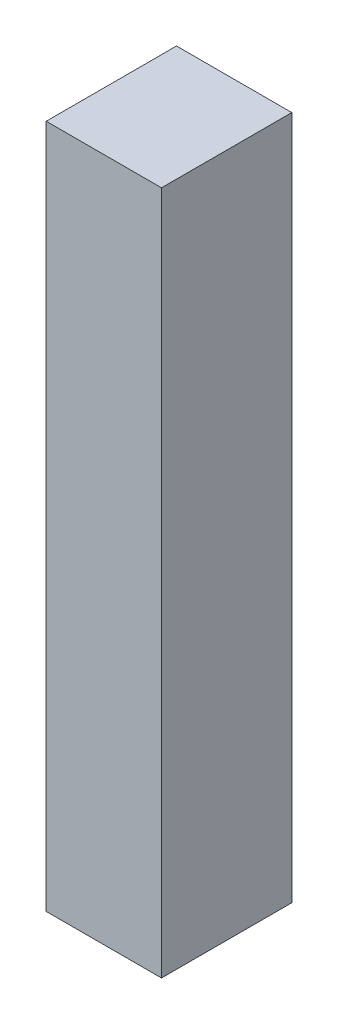
ISO-10303-21;
HEADER;
FILE_DESCRIPTION(('STEP AP214'),'2;1');
FILE_NAME('part.step','',(''),(''),'','','');
FILE_SCHEMA(('AUTOMOTIVE_DESIGN { 1 0 10303 214 1 1 1 1 }'));
ENDSEC;
DATA;
#1=APPLICATION_CONTEXT('core data for automotive mechanical design processes');
#2=APPLICATION_PROTOCOL_DEFINITION('international standard','automotive_design',2000,#1);
#3=PRODUCT_CONTEXT('',#1,'mechanical');
#4=PRODUCT('Part','Part','',(#3));
#5=PRODUCT_RELATED_PRODUCT_CATEGORY('part','',(#4));
#6=PRODUCT_DEFINITION_FORMATION('','',#4);
#7=PRODUCT_DEFINITION_CONTEXT('part definition',#1,'design');
#8=PRODUCT_DEFINITION('design','',#6,#7);
#9=PRODUCT_DEFINITION_SHAPE('','',#8);
#10=(LENGTH_UNIT() NAMED_UNIT(*) SI_UNIT(.MILLI.,.METRE.));
#11=(NAMED_UNIT(*) PLANE_ANGLE_UNIT() SI_UNIT($,.RADIAN.));
#12=(NAMED_UNIT(*) SI_UNIT($,.STERADIAN.) SOLID_ANGLE_UNIT());
#13=UNCERTAINTY_MEASURE_WITH_UNIT(LENGTH_MEASURE(1.E-05),#10,'distance_accuracy_value','');
#14=(GEOMETRIC_REPRESENTATION_CONTEXT(3) GLOBAL_UNCERTAINTY_ASSIGNED_CONTEXT((#13)) GLOBAL_UNIT_ASSIGNED_CONTEXT((#10,
#11,#12)) REPRESENTATION_CONTEXT('',''));
#15=CARTESIAN_POINT('',(0.,0.,0.));
#16=DIRECTION('',(0.,0.,1.));
#17=DIRECTION('',(1.,0.,0.));
#18=AXIS2_PLACEMENT_3D('',#15,#16,#17);
#19=CARTESIAN_POINT('',(-2.227297174631,0.759200536932928,0.));
#20=DIRECTION('',(1.,0.,0.));
#21=DIRECTION('',(0.,1.,0.));
#22=AXIS2_PLACEMENT_3D('',#19,#20,#21);
#23=PLANE('',#22);
#24=DIRECTION('',(0.,-1.,0.));
#25=VECTOR('',#24,1.);
#26=CARTESIAN_POINT('',(-2.227297174631,1.28436413185,0.));
#27=LINE('',#26,#25);
#28=CARTESIAN_POINT('',(-2.227297174631,1.28436413185,0.));
#29=VERTEX_POINT('',#28);
#30=CARTESIAN_POINT('',(-2.227297174631,0.759200536932928,0.));
#31=VERTEX_POINT('',#30);
#32=EDGE_CURVE('E11',#29,#31,#27,.T.);
#33=ORIENTED_EDGE('',*,*,#32,.F.);
#34=DIRECTION('',(0.,0.,1.));
#35=VECTOR('',#34,1.);
#36=CARTESIAN_POINT('',(-2.227297174631,1.28436413185,0.));
#37=LINE('',#36,#35);
#38=CARTESIAN_POINT('',(-2.227297174631,1.28436413185,0.1));
#39=VERTEX_POINT('',#38);
#40=EDGE_CURVE('E24',#29,#39,#37,.T.);
#41=ORIENTED_EDGE('',*,*,#40,.T.);
#42=DIRECTION('',(0.,1.,0.));
#43=VECTOR('',#42,1.);
#44=CARTESIAN_POINT('',(-2.227297174631,1.28436413185,0.1));
#45=LINE('',#44,#43);
#46=CARTESIAN_POINT('',(-2.227297174631,0.759200536932928,0.1));
#47=VERTEX_POINT('',#46);
#48=EDGE_CURVE('E75',#47,#39,#45,.T.);
#49=ORIENTED_EDGE('',*,*,#48,.F.);
#50=DIRECTION('',(0.,0.,1.));
#51=VECTOR('',#50,1.);
#52=CARTESIAN_POINT('',(-2.227297174631,0.759200536932928,0.));
#53=LINE('',#52,#51);
#54=EDGE_CURVE('E85',#31,#47,#53,.T.);
#55=ORIENTED_EDGE('',*,*,#54,.F.);
#56=EDGE_LOOP('',(#33,#41,#49,#55));
#57=FACE_BOUND('',#56,.T.);
#58=ADVANCED_FACE('F17',(#57),#23,.T.);
#59=CARTESIAN_POINT('',(-2.315769659304,0.759200536932928,0.));
#60=DIRECTION('',(0.,-1.,0.));
#61=DIRECTION('',(1.,0.,0.));
#62=AXIS2_PLACEMENT_3D('',#59,#60,#61);
#63=PLANE('',#62);
#64=DIRECTION('',(-1.,0.,0.));
#65=VECTOR('',#64,1.);
#66=CARTESIAN_POINT('',(-2.227297174631,0.759200536932928,0.));
#67=LINE('',#66,#65);
#68=CARTESIAN_POINT('',(-2.315769659304,0.759200536932928,0.));
#69=VERTEX_POINT('',#68);
#70=EDGE_CURVE('E83',#31,#69,#67,.T.);
#71=ORIENTED_EDGE('',*,*,#70,.F.);
#72=ORIENTED_EDGE('',*,*,#54,.T.);
#73=DIRECTION('',(1.,0.,0.));
#74=VECTOR('',#73,1.);
#75=CARTESIAN_POINT('',(-2.227297174631,0.759200536932928,0.1));
#76=LINE('',#75,#74);
#77=CARTESIAN_POINT('',(-2.315769659304,0.759200536932928,0.1));
#78=VERTEX_POINT('',#77);
#79=EDGE_CURVE('E81',#78,#47,#76,.T.);
#80=ORIENTED_EDGE('',*,*,#79,.F.);
#81=DIRECTION('',(0.,0.,1.));
#82=VECTOR('',#81,1.);
#83=CARTESIAN_POINT('',(-2.315769659304,0.759200536932928,0.));
#84=LINE('',#83,#82);
#85=EDGE_CURVE('E61',#69,#78,#84,.T.);
#86=ORIENTED_EDGE('',*,*,#85,.F.);
#87=EDGE_LOOP('',(#71,#72,#80,#86));
#88=FACE_BOUND('',#87,.T.);
#89=ADVANCED_FACE('F91',(#88),#63,.T.);
#90=CARTESIAN_POINT('',(-2.315769659304,1.28436413185,0.));
#91=DIRECTION('',(-1.,0.,0.));
#92=DIRECTION('',(0.,-1.,0.));
#93=AXIS2_PLACEMENT_3D('',#90,#91,#92);
#94=PLANE('',#93);
#95=DIRECTION('',(0.,1.,0.));
#96=VECTOR('',#95,1.);
#97=CARTESIAN_POINT('',(-2.315769659304,0.759200536932928,0.));
#98=LINE('',#97,#96);
#99=CARTESIAN_POINT('',(-2.315769659304,1.28436413185,0.));
#100=VERTEX_POINT('',#99);
#101=EDGE_CURVE('E65',#69,#100,#98,.T.);
#102=ORIENTED_EDGE('',*,*,#101,.F.);
#103=ORIENTED_EDGE('',*,*,#85,.T.);
#104=DIRECTION('',(0.,-1.,0.));
#105=VECTOR('',#104,1.);
#106=CARTESIAN_POINT('',(-2.315769659304,0.759200536932928,0.1));
#107=LINE('',#106,#105);
#108=CARTESIAN_POINT('',(-2.315769659304,1.28436413185,0.1));
#109=VERTEX_POINT('',#108);
#110=EDGE_CURVE('E54',#109,#78,#107,.T.);
#111=ORIENTED_EDGE('',*,*,#110,.F.);
#112=DIRECTION('',(0.,0.,1.));
#113=VECTOR('',#112,1.);
#114=CARTESIAN_POINT('',(-2.315769659304,1.28436413185,0.));
#115=LINE('',#114,#113);
#116=EDGE_CURVE('E58',#100,#109,#115,.T.);
#117=ORIENTED_EDGE('',*,*,#116,.F.);
#118=EDGE_LOOP('',(#102,#103,#111,#117));
#119=FACE_BOUND('',#118,.T.);
#120=ADVANCED_FACE('F57',(#119),#94,.T.);
#121=CARTESIAN_POINT('',(-2.227297174631,1.28436413185,0.));
#122=DIRECTION('',(0.,1.,0.));
#123=DIRECTION('',(-1.,0.,0.));
#124=AXIS2_PLACEMENT_3D('',#121,#122,#123);
#125=PLANE('',#124);
#126=DIRECTION('',(1.,0.,0.));
#127=VECTOR('',#126,1.);
#128=CARTESIAN_POINT('',(-2.315769659304,1.28436413185,0.));
#129=LINE('',#128,#127);
#130=EDGE_CURVE('E71',#100,#29,#129,.T.);
#131=ORIENTED_EDGE('',*,*,#130,.F.);
#132=ORIENTED_EDGE('',*,*,#116,.T.);
#133=DIRECTION('',(-1.,0.,0.));
#134=VECTOR('',#133,1.);
#135=CARTESIAN_POINT('',(-2.315769659304,1.28436413185,0.1));
#136=LINE('',#135,#134);
#137=EDGE_CURVE('E70',#39,#109,#136,.T.);
#138=ORIENTED_EDGE('',*,*,#137,.F.);
#139=ORIENTED_EDGE('',*,*,#40,.F.);
#140=EDGE_LOOP('',(#131,#132,#138,#139));
#141=FACE_BOUND('',#140,.T.);
#142=ADVANCED_FACE('F69',(#141),#125,.T.);
#143=CARTESIAN_POINT('',(-2.271533416967,1.021782334391,0.));
#144=DIRECTION('',(0.,0.,1.));
#145=DIRECTION('',(1.,0.,0.));
#146=AXIS2_PLACEMENT_3D('',#143,#144,#145);
#147=PLANE('',#146);
#148=ORIENTED_EDGE('',*,*,#130,.T.);
#149=ORIENTED_EDGE('',*,*,#32,.T.);
#150=ORIENTED_EDGE('',*,*,#70,.T.);
#151=ORIENTED_EDGE('',*,*,#101,.T.);
#152=EDGE_LOOP('',(#148,#149,#150,#151));
#153=FACE_BOUND('',#152,.T.);
#154=ADVANCED_FACE('F88',(#153),#147,.F.);
#155=CARTESIAN_POINT('',(-2.271533416967,1.021782334391,0.1));
#156=DIRECTION('',(0.,0.,1.));
#157=DIRECTION('',(1.,0.,0.));
#158=AXIS2_PLACEMENT_3D('',#155,#156,#157);
#159=PLANE('',#158);
#160=ORIENTED_EDGE('',*,*,#137,.T.);
#161=ORIENTED_EDGE('',*,*,#110,.T.);
#162=ORIENTED_EDGE('',*,*,#79,.T.);
#163=ORIENTED_EDGE('',*,*,#48,.T.);
#164=EDGE_LOOP('',(#160,#161,#162,#163));
#165=FACE_BOUND('',#164,.T.);
#166=ADVANCED_FACE('F74',(#165),#159,.T.);
#167=CLOSED_SHELL('',(#58,#89,#120,#142,#154,#166));
#168=MANIFOLD_SOLID_BREP('B1',#167);
#169=ADVANCED_BREP_SHAPE_REPRESENTATION('',(#18,#168),#14);
#170=SHAPE_DEFINITION_REPRESENTATION(#9,#169);
ENDSEC;
END-ISO-10303-21;
